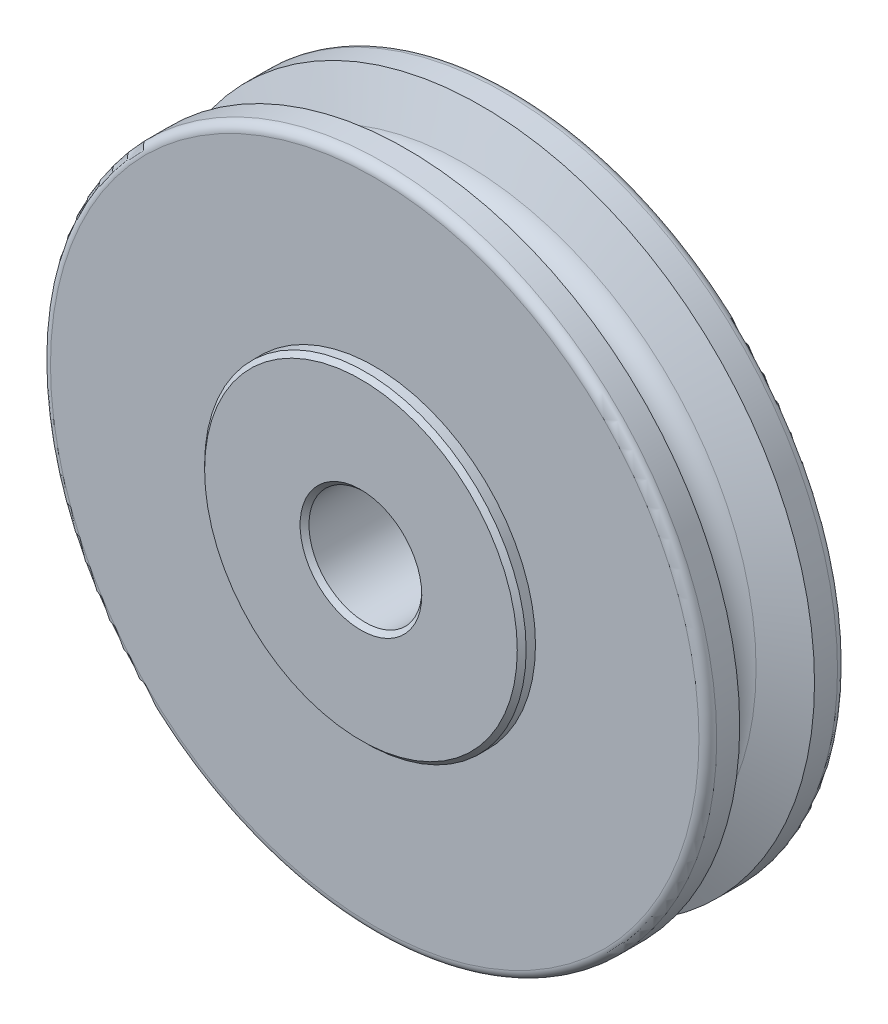
ISO-10303-21;
HEADER;
FILE_DESCRIPTION(('STEP AP214'),'2;1');
FILE_NAME('part.step','',(''),(''),'','','');
FILE_SCHEMA(('AUTOMOTIVE_DESIGN { 1 0 10303 214 1 1 1 1 }'));
ENDSEC;
DATA;
#1=APPLICATION_CONTEXT('core data for automotive mechanical design processes');
#2=APPLICATION_PROTOCOL_DEFINITION('international standard','automotive_design',2000,#1);
#3=PRODUCT_CONTEXT('',#1,'mechanical');
#4=PRODUCT('Part','Part','',(#3));
#5=PRODUCT_RELATED_PRODUCT_CATEGORY('part','',(#4));
#6=PRODUCT_DEFINITION_FORMATION('','',#4);
#7=PRODUCT_DEFINITION_CONTEXT('part definition',#1,'design');
#8=PRODUCT_DEFINITION('design','',#6,#7);
#9=PRODUCT_DEFINITION_SHAPE('','',#8);
#10=(LENGTH_UNIT() NAMED_UNIT(*) SI_UNIT(.MILLI.,.METRE.));
#11=(NAMED_UNIT(*) PLANE_ANGLE_UNIT() SI_UNIT($,.RADIAN.));
#12=(NAMED_UNIT(*) SI_UNIT($,.STERADIAN.) SOLID_ANGLE_UNIT());
#13=UNCERTAINTY_MEASURE_WITH_UNIT(LENGTH_MEASURE(1.E-05),#10,'distance_accuracy_value','');
#14=(GEOMETRIC_REPRESENTATION_CONTEXT(3) GLOBAL_UNCERTAINTY_ASSIGNED_CONTEXT((#13)) GLOBAL_UNIT_ASSIGNED_CONTEXT((#10,
#11,#12)) REPRESENTATION_CONTEXT('',''));
#15=CARTESIAN_POINT('',(0.,0.,0.));
#16=DIRECTION('',(0.,0.,1.));
#17=DIRECTION('',(1.,0.,0.));
#18=AXIS2_PLACEMENT_3D('',#15,#16,#17);
#19=CARTESIAN_POINT('',(0.,4.5974,1.9812));
#20=DIRECTION('',(0.,0.,-1.));
#21=DIRECTION('',(-1.,0.,0.));
#22=AXIS2_PLACEMENT_3D('',#19,#20,#21);
#23=PLANE('',#22);
#24=CARTESIAN_POINT('',(0.,0.,1.9812));
#25=DIRECTION('',(0.,0.,1.));
#26=DIRECTION('',(1.,0.,0.));
#27=AXIS2_PLACEMENT_3D('',#24,#25,#26);
#28=CIRCLE('',#27,4.5974);
#29=CARTESIAN_POINT('',(4.5974,0.,1.9812));
#30=VERTEX_POINT('',#29);
#31=EDGE_CURVE('E92',#30,#30,#28,.T.);
#32=ORIENTED_EDGE('',*,*,#31,.F.);
#33=EDGE_LOOP('',(#32));
#34=FACE_BOUND('',#33,.T.);
#35=CARTESIAN_POINT('',(0.,0.,1.9812));
#36=DIRECTION('',(0.,0.,1.));
#37=DIRECTION('',(1.,0.,0.));
#38=AXIS2_PLACEMENT_3D('',#35,#36,#37);
#39=CIRCLE('',#38,9.271);
#40=CARTESIAN_POINT('',(9.271,0.,1.9812));
#41=VERTEX_POINT('',#40);
#42=EDGE_CURVE('E11',#41,#41,#39,.T.);
#43=ORIENTED_EDGE('',*,*,#42,.T.);
#44=EDGE_LOOP('',(#43));
#45=FACE_BOUND('',#44,.T.);
#46=ADVANCED_FACE('F47',(#34,#45),#23,.F.);
#47=CARTESIAN_POINT('',(0.,0.,1.7272));
#48=DIRECTION('',(0.,0.,1.));
#49=DIRECTION('',(1.,0.,0.));
#50=AXIS2_PLACEMENT_3D('',#47,#48,#49);
#51=TOROIDAL_SURFACE('',#50,9.271,0.254000000000001);
#52=ORIENTED_EDGE('',*,*,#42,.F.);
#53=EDGE_LOOP('',(#52));
#54=FACE_BOUND('',#53,.T.);
#55=CARTESIAN_POINT('',(0.,0.,1.7272));
#56=DIRECTION('',(0.,0.,1.));
#57=DIRECTION('',(1.,0.,0.));
#58=AXIS2_PLACEMENT_3D('',#55,#56,#57);
#59=CIRCLE('',#58,9.525);
#60=CARTESIAN_POINT('',(9.525,0.,1.7272));
#61=VERTEX_POINT('',#60);
#62=EDGE_CURVE('E54',#61,#61,#59,.T.);
#63=ORIENTED_EDGE('',*,*,#62,.T.);
#64=EDGE_LOOP('',(#63));
#65=FACE_BOUND('',#64,.T.);
#66=ADVANCED_FACE('F101',(#54,#65),#51,.T.);
#67=CARTESIAN_POINT('',(0.,0.,2.3749));
#68=DIRECTION('',(0.,0.,1.));
#69=DIRECTION('',(1.,0.,0.));
#70=AXIS2_PLACEMENT_3D('',#67,#68,#69);
#71=CYLINDRICAL_SURFACE('',#70,9.525);
#72=ORIENTED_EDGE('',*,*,#62,.F.);
#73=EDGE_LOOP('',(#72));
#74=FACE_BOUND('',#73,.T.);
#75=CARTESIAN_POINT('',(0.,0.,1.06970454170825));
#76=DIRECTION('',(0.,0.,1.));
#77=DIRECTION('',(1.,0.,0.));
#78=AXIS2_PLACEMENT_3D('',#75,#76,#77);
#79=CIRCLE('',#78,9.525);
#80=CARTESIAN_POINT('',(9.525,0.,1.06970454170825));
#81=VERTEX_POINT('',#80);
#82=EDGE_CURVE('E60',#81,#81,#79,.T.);
#83=ORIENTED_EDGE('',*,*,#82,.T.);
#84=EDGE_LOOP('',(#83));
#85=FACE_BOUND('',#84,.T.);
#86=ADVANCED_FACE('F105',(#74,#85),#71,.T.);
#87=CARTESIAN_POINT('',(0.,0.,0.588761747649908));
#88=DIRECTION('',(0.,0.,1.));
#89=DIRECTION('',(1.,0.,0.));
#90=AXIS2_PLACEMENT_3D('',#87,#88,#89);
#91=CONICAL_SURFACE('',#90,8.33462481318089,1.18682389135614);
#92=ORIENTED_EDGE('',*,*,#82,.F.);
#93=EDGE_LOOP('',(#92));
#94=FACE_BOUND('',#93,.T.);
#95=CARTESIAN_POINT('',(0.,0.,0.588761747649908));
#96=DIRECTION('',(0.,0.,1.));
#97=DIRECTION('',(1.,0.,0.));
#98=AXIS2_PLACEMENT_3D('',#95,#96,#97);
#99=CIRCLE('',#98,8.33462481318089);
#100=CARTESIAN_POINT('',(8.33462481318089,0.,0.588761747649908));
#101=VERTEX_POINT('',#100);
#102=EDGE_CURVE('E66',#101,#101,#99,.T.);
#103=ORIENTED_EDGE('',*,*,#102,.T.);
#104=EDGE_LOOP('',(#103));
#105=FACE_BOUND('',#104,.T.);
#106=ADVANCED_FACE('F110',(#94,#105),#91,.T.);
#107=CARTESIAN_POINT('',(0.,0.,0.));
#108=DIRECTION('',(0.,0.,1.));
#109=DIRECTION('',(1.,0.,0.));
#110=AXIS2_PLACEMENT_3D('',#107,#108,#109);
#111=TOROIDAL_SURFACE('',#110,8.5725,0.635000000000002);
#112=ORIENTED_EDGE('',*,*,#102,.F.);
#113=EDGE_LOOP('',(#112));
#114=FACE_BOUND('',#113,.T.);
#115=CARTESIAN_POINT('',(0.,0.,-0.588761747649914));
#116=DIRECTION('',(0.,0.,1.));
#117=DIRECTION('',(1.,0.,0.));
#118=AXIS2_PLACEMENT_3D('',#115,#116,#117);
#119=CIRCLE('',#118,8.33462481318089);
#120=CARTESIAN_POINT('',(8.33462481318089,0.,-0.588761747649914));
#121=VERTEX_POINT('',#120);
#122=EDGE_CURVE('E72',#121,#121,#119,.T.);
#123=ORIENTED_EDGE('',*,*,#122,.T.);
#124=EDGE_LOOP('',(#123));
#125=FACE_BOUND('',#124,.T.);
#126=ADVANCED_FACE('F116',(#114,#125),#111,.F.);
#127=CARTESIAN_POINT('',(0.,0.,-1.06970454170826));
#128=DIRECTION('',(0.,0.,-1.));
#129=DIRECTION('',(-1.,0.,0.));
#130=AXIS2_PLACEMENT_3D('',#127,#128,#129);
#131=CONICAL_SURFACE('',#130,9.525,1.18682389135614);
#132=ORIENTED_EDGE('',*,*,#122,.F.);
#133=EDGE_LOOP('',(#132));
#134=FACE_BOUND('',#133,.T.);
#135=CARTESIAN_POINT('',(0.,0.,-1.06970454170826));
#136=DIRECTION('',(0.,0.,1.));
#137=DIRECTION('',(1.,0.,0.));
#138=AXIS2_PLACEMENT_3D('',#135,#136,#137);
#139=CIRCLE('',#138,9.525);
#140=CARTESIAN_POINT('',(9.525,0.,-1.06970454170826));
#141=VERTEX_POINT('',#140);
#142=EDGE_CURVE('E76',#141,#141,#139,.T.);
#143=ORIENTED_EDGE('',*,*,#142,.T.);
#144=EDGE_LOOP('',(#143));
#145=FACE_BOUND('',#144,.T.);
#146=ADVANCED_FACE('F120',(#134,#145),#131,.T.);
#147=CARTESIAN_POINT('',(0.,0.,2.3749));
#148=DIRECTION('',(0.,0.,1.));
#149=DIRECTION('',(1.,0.,0.));
#150=AXIS2_PLACEMENT_3D('',#147,#148,#149);
#151=CYLINDRICAL_SURFACE('',#150,9.525);
#152=ORIENTED_EDGE('',*,*,#142,.F.);
#153=EDGE_LOOP('',(#152));
#154=FACE_BOUND('',#153,.T.);
#155=CARTESIAN_POINT('',(0.,0.,-1.7272));
#156=DIRECTION('',(0.,0.,1.));
#157=DIRECTION('',(1.,0.,0.));
#158=AXIS2_PLACEMENT_3D('',#155,#156,#157);
#159=CIRCLE('',#158,9.525);
#160=CARTESIAN_POINT('',(9.525,0.,-1.7272));
#161=VERTEX_POINT('',#160);
#162=EDGE_CURVE('E80',#161,#161,#159,.T.);
#163=ORIENTED_EDGE('',*,*,#162,.T.);
#164=EDGE_LOOP('',(#163));
#165=FACE_BOUND('',#164,.T.);
#166=ADVANCED_FACE('F124',(#154,#165),#151,.T.);
#167=CARTESIAN_POINT('',(0.,0.,-1.7272));
#168=DIRECTION('',(0.,0.,1.));
#169=DIRECTION('',(1.,0.,0.));
#170=AXIS2_PLACEMENT_3D('',#167,#168,#169);
#171=TOROIDAL_SURFACE('',#170,9.271,0.254000000000001);
#172=ORIENTED_EDGE('',*,*,#162,.F.);
#173=EDGE_LOOP('',(#172));
#174=FACE_BOUND('',#173,.T.);
#175=CARTESIAN_POINT('',(0.,0.,-1.9812));
#176=DIRECTION('',(0.,0.,1.));
#177=DIRECTION('',(1.,0.,0.));
#178=AXIS2_PLACEMENT_3D('',#175,#176,#177);
#179=CIRCLE('',#178,9.271);
#180=CARTESIAN_POINT('',(9.271,0.,-1.9812));
#181=VERTEX_POINT('',#180);
#182=EDGE_CURVE('E84',#181,#181,#179,.T.);
#183=ORIENTED_EDGE('',*,*,#182,.T.);
#184=EDGE_LOOP('',(#183));
#185=FACE_BOUND('',#184,.T.);
#186=ADVANCED_FACE('F128',(#174,#185),#171,.T.);
#187=CARTESIAN_POINT('',(0.,4.5974,-1.9812));
#188=DIRECTION('',(0.,0.,1.));
#189=DIRECTION('',(1.,0.,0.));
#190=AXIS2_PLACEMENT_3D('',#187,#188,#189);
#191=PLANE('',#190);
#192=ORIENTED_EDGE('',*,*,#182,.F.);
#193=EDGE_LOOP('',(#192));
#194=FACE_BOUND('',#193,.T.);
#195=CARTESIAN_POINT('',(0.,0.,-1.9812));
#196=DIRECTION('',(0.,0.,1.));
#197=DIRECTION('',(1.,0.,0.));
#198=AXIS2_PLACEMENT_3D('',#195,#196,#197);
#199=CIRCLE('',#198,4.5974);
#200=CARTESIAN_POINT('',(4.5974,0.,-1.9812));
#201=VERTEX_POINT('',#200);
#202=EDGE_CURVE('E88',#201,#201,#199,.T.);
#203=ORIENTED_EDGE('',*,*,#202,.T.);
#204=EDGE_LOOP('',(#203));
#205=FACE_BOUND('',#204,.T.);
#206=ADVANCED_FACE('F132',(#194,#205),#191,.F.);
#207=CARTESIAN_POINT('',(0.,0.,2.3749));
#208=DIRECTION('',(0.,0.,1.));
#209=DIRECTION('',(1.,0.,0.));
#210=AXIS2_PLACEMENT_3D('',#207,#208,#209);
#211=CYLINDRICAL_SURFACE('',#210,4.5974);
#212=ORIENTED_EDGE('',*,*,#202,.F.);
#213=EDGE_LOOP('',(#212));
#214=FACE_BOUND('',#213,.T.);
#215=ORIENTED_EDGE('',*,*,#31,.T.);
#216=EDGE_LOOP('',(#215));
#217=FACE_BOUND('',#216,.T.);
#218=ADVANCED_FACE('F98',(#214,#217),#211,.F.);
#219=CLOSED_SHELL('',(#46,#66,#86,#106,#126,#146,#166,#186,#206,#218));
#220=MANIFOLD_SOLID_BREP('B2',#219);
#221=CARTESIAN_POINT('',(0.,0.,2.2479));
#222=DIRECTION('',(0.,0.,-1.));
#223=DIRECTION('',(-1.,0.,0.));
#224=AXIS2_PLACEMENT_3D('',#221,#222,#223);
#225=CONICAL_SURFACE('',#224,4.5974,0.785398163397448);
#226=CARTESIAN_POINT('',(0.,0.,2.3749));
#227=DIRECTION('',(0.,0.,1.));
#228=DIRECTION('',(1.,0.,0.));
#229=AXIS2_PLACEMENT_3D('',#226,#227,#228);
#230=CIRCLE('',#229,4.4704);
#231=CARTESIAN_POINT('',(4.4704,0.,2.3749));
#232=VERTEX_POINT('',#231);
#233=EDGE_CURVE('E46',#232,#232,#230,.T.);
#234=ORIENTED_EDGE('',*,*,#233,.F.);
#235=EDGE_LOOP('',(#234));
#236=FACE_BOUND('',#235,.T.);
#237=CARTESIAN_POINT('',(0.,0.,2.2479));
#238=DIRECTION('',(0.,0.,1.));
#239=DIRECTION('',(1.,0.,0.));
#240=AXIS2_PLACEMENT_3D('',#237,#238,#239);
#241=CIRCLE('',#240,4.5974);
#242=CARTESIAN_POINT('',(4.5974,0.,2.2479));
#243=VERTEX_POINT('',#242);
#244=EDGE_CURVE('E256',#243,#243,#241,.T.);
#245=ORIENTED_EDGE('',*,*,#244,.T.);
#246=EDGE_LOOP('',(#245));
#247=FACE_BOUND('',#246,.T.);
#248=ADVANCED_FACE('F219',(#236,#247),#225,.T.);
#249=CARTESIAN_POINT('',(0.,4.4704,2.3749));
#250=DIRECTION('',(0.,0.,-1.));
#251=DIRECTION('',(-1.,0.,0.));
#252=AXIS2_PLACEMENT_3D('',#249,#250,#251);
#253=PLANE('',#252);
#254=CARTESIAN_POINT('',(0.,0.,2.3749));
#255=DIRECTION('',(0.,0.,1.));
#256=DIRECTION('',(1.,0.,0.));
#257=AXIS2_PLACEMENT_3D('',#254,#255,#256);
#258=CIRCLE('',#257,1.7399);
#259=CARTESIAN_POINT('',(1.7399,0.,2.3749));
#260=VERTEX_POINT('',#259);
#261=EDGE_CURVE('E226',#260,#260,#258,.T.);
#262=ORIENTED_EDGE('',*,*,#261,.F.);
#263=EDGE_LOOP('',(#262));
#264=FACE_BOUND('',#263,.T.);
#265=ORIENTED_EDGE('',*,*,#233,.T.);
#266=EDGE_LOOP('',(#265));
#267=FACE_BOUND('',#266,.T.);
#268=ADVANCED_FACE('F295',(#264,#267),#253,.F.);
#269=CARTESIAN_POINT('',(0.,0.,2.3749));
#270=DIRECTION('',(0.,0.,1.));
#271=DIRECTION('',(1.,0.,0.));
#272=AXIS2_PLACEMENT_3D('',#269,#270,#271);
#273=CONICAL_SURFACE('',#272,1.7399,0.785398163397447);
#274=CARTESIAN_POINT('',(0.,0.,2.2479));
#275=DIRECTION('',(0.,0.,1.));
#276=DIRECTION('',(1.,0.,0.));
#277=AXIS2_PLACEMENT_3D('',#274,#275,#276);
#278=CIRCLE('',#277,1.6129);
#279=CARTESIAN_POINT('',(1.6129,0.,2.2479));
#280=VERTEX_POINT('',#279);
#281=EDGE_CURVE('E232',#280,#280,#278,.T.);
#282=ORIENTED_EDGE('',*,*,#281,.F.);
#283=EDGE_LOOP('',(#282));
#284=FACE_BOUND('',#283,.T.);
#285=ORIENTED_EDGE('',*,*,#261,.T.);
#286=EDGE_LOOP('',(#285));
#287=FACE_BOUND('',#286,.T.);
#288=ADVANCED_FACE('F290',(#284,#287),#273,.F.);
#289=CARTESIAN_POINT('',(0.,0.,2.3749));
#290=DIRECTION('',(0.,0.,1.));
#291=DIRECTION('',(1.,0.,0.));
#292=AXIS2_PLACEMENT_3D('',#289,#290,#291);
#293=CYLINDRICAL_SURFACE('',#292,1.6129);
#294=CARTESIAN_POINT('',(0.,0.,-2.2479));
#295=DIRECTION('',(0.,0.,1.));
#296=DIRECTION('',(1.,0.,0.));
#297=AXIS2_PLACEMENT_3D('',#294,#295,#296);
#298=CIRCLE('',#297,1.6129);
#299=CARTESIAN_POINT('',(1.6129,0.,-2.2479));
#300=VERTEX_POINT('',#299);
#301=EDGE_CURVE('E238',#300,#300,#298,.T.);
#302=ORIENTED_EDGE('',*,*,#301,.F.);
#303=EDGE_LOOP('',(#302));
#304=FACE_BOUND('',#303,.T.);
#305=ORIENTED_EDGE('',*,*,#281,.T.);
#306=EDGE_LOOP('',(#305));
#307=FACE_BOUND('',#306,.T.);
#308=ADVANCED_FACE('F284',(#304,#307),#293,.F.);
#309=CARTESIAN_POINT('',(0.,0.,-2.2479));
#310=DIRECTION('',(0.,0.,-1.));
#311=DIRECTION('',(-1.,0.,0.));
#312=AXIS2_PLACEMENT_3D('',#309,#310,#311);
#313=CONICAL_SURFACE('',#312,1.6129,0.785398163397447);
#314=CARTESIAN_POINT('',(0.,0.,-2.3749));
#315=DIRECTION('',(0.,0.,1.));
#316=DIRECTION('',(1.,0.,0.));
#317=AXIS2_PLACEMENT_3D('',#314,#315,#316);
#318=CIRCLE('',#317,1.7399);
#319=CARTESIAN_POINT('',(1.7399,0.,-2.3749));
#320=VERTEX_POINT('',#319);
#321=EDGE_CURVE('E244',#320,#320,#318,.T.);
#322=ORIENTED_EDGE('',*,*,#321,.F.);
#323=EDGE_LOOP('',(#322));
#324=FACE_BOUND('',#323,.T.);
#325=ORIENTED_EDGE('',*,*,#301,.T.);
#326=EDGE_LOOP('',(#325));
#327=FACE_BOUND('',#326,.T.);
#328=ADVANCED_FACE('F278',(#324,#327),#313,.F.);
#329=CARTESIAN_POINT('',(0.,1.7399,-2.3749));
#330=DIRECTION('',(0.,0.,1.));
#331=DIRECTION('',(1.,0.,0.));
#332=AXIS2_PLACEMENT_3D('',#329,#330,#331);
#333=PLANE('',#332);
#334=CARTESIAN_POINT('',(0.,0.,-2.3749));
#335=DIRECTION('',(0.,0.,1.));
#336=DIRECTION('',(1.,0.,0.));
#337=AXIS2_PLACEMENT_3D('',#334,#335,#336);
#338=CIRCLE('',#337,4.4704);
#339=CARTESIAN_POINT('',(4.4704,0.,-2.3749));
#340=VERTEX_POINT('',#339);
#341=EDGE_CURVE('E248',#340,#340,#338,.T.);
#342=ORIENTED_EDGE('',*,*,#341,.F.);
#343=EDGE_LOOP('',(#342));
#344=FACE_BOUND('',#343,.T.);
#345=ORIENTED_EDGE('',*,*,#321,.T.);
#346=EDGE_LOOP('',(#345));
#347=FACE_BOUND('',#346,.T.);
#348=ADVANCED_FACE('F272',(#344,#347),#333,.F.);
#349=CARTESIAN_POINT('',(0.,0.,-2.3749));
#350=DIRECTION('',(0.,0.,1.));
#351=DIRECTION('',(1.,0.,0.));
#352=AXIS2_PLACEMENT_3D('',#349,#350,#351);
#353=CONICAL_SURFACE('',#352,4.4704,0.785398163397452);
#354=CARTESIAN_POINT('',(0.,0.,-2.2479));
#355=DIRECTION('',(0.,0.,1.));
#356=DIRECTION('',(1.,0.,0.));
#357=AXIS2_PLACEMENT_3D('',#354,#355,#356);
#358=CIRCLE('',#357,4.5974);
#359=CARTESIAN_POINT('',(4.5974,0.,-2.2479));
#360=VERTEX_POINT('',#359);
#361=EDGE_CURVE('E252',#360,#360,#358,.T.);
#362=ORIENTED_EDGE('',*,*,#361,.F.);
#363=EDGE_LOOP('',(#362));
#364=FACE_BOUND('',#363,.T.);
#365=ORIENTED_EDGE('',*,*,#341,.T.);
#366=EDGE_LOOP('',(#365));
#367=FACE_BOUND('',#366,.T.);
#368=ADVANCED_FACE('F266',(#364,#367),#353,.T.);
#369=CARTESIAN_POINT('',(0.,0.,2.3749));
#370=DIRECTION('',(0.,0.,1.));
#371=DIRECTION('',(1.,0.,0.));
#372=AXIS2_PLACEMENT_3D('',#369,#370,#371);
#373=CYLINDRICAL_SURFACE('',#372,4.5974);
#374=ORIENTED_EDGE('',*,*,#244,.F.);
#375=EDGE_LOOP('',(#374));
#376=FACE_BOUND('',#375,.T.);
#377=ORIENTED_EDGE('',*,*,#361,.T.);
#378=EDGE_LOOP('',(#377));
#379=FACE_BOUND('',#378,.T.);
#380=ADVANCED_FACE('F263',(#376,#379),#373,.T.);
#381=CLOSED_SHELL('',(#248,#268,#288,#308,#328,#348,#368,#380));
#382=MANIFOLD_SOLID_BREP('B6',#381);
#383=ADVANCED_BREP_SHAPE_REPRESENTATION('',(#18,#220,#382),#14);
#384=SHAPE_DEFINITION_REPRESENTATION(#9,#383);
ENDSEC;
END-ISO-10303-21;
